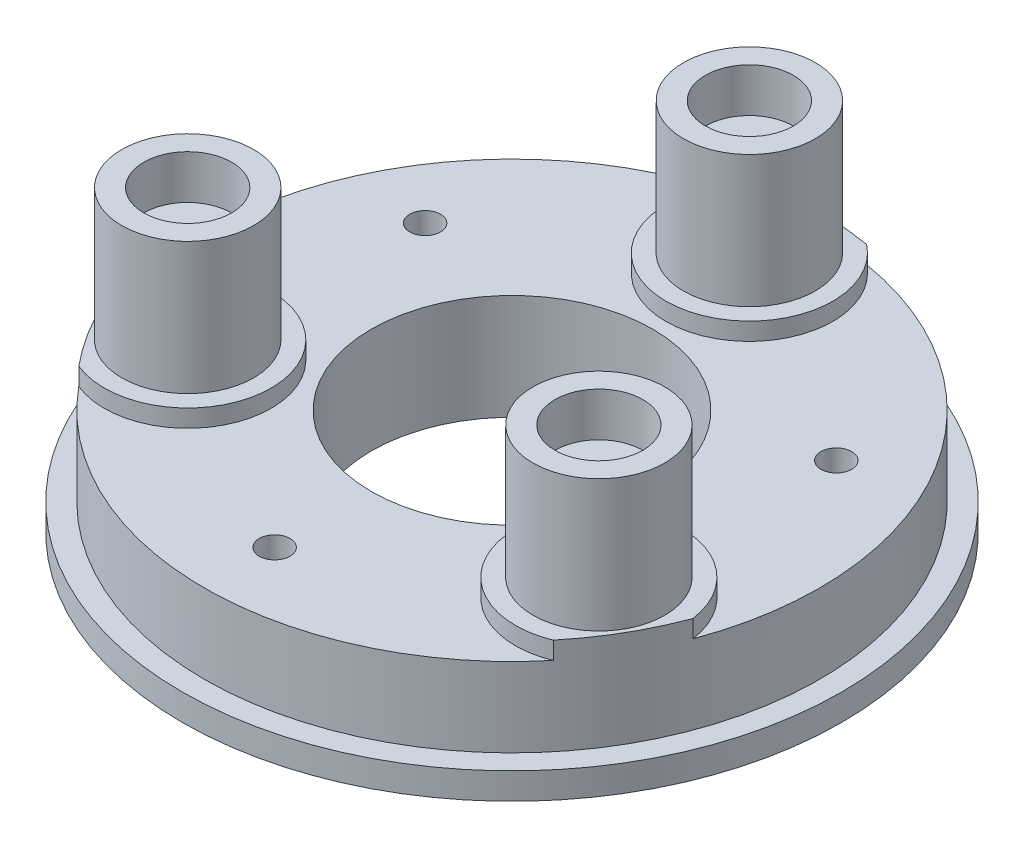
ISO-10303-21;
HEADER;
FILE_DESCRIPTION(('STEP AP214'),'2;1');
FILE_NAME('part.step','',(''),(''),'','','');
FILE_SCHEMA(('AUTOMOTIVE_DESIGN { 1 0 10303 214 1 1 1 1 }'));
ENDSEC;
DATA;
#1=APPLICATION_CONTEXT('core data for automotive mechanical design processes');
#2=APPLICATION_PROTOCOL_DEFINITION('international standard','automotive_design',2000,#1);
#3=PRODUCT_CONTEXT('',#1,'mechanical');
#4=PRODUCT('Part','Part','',(#3));
#5=PRODUCT_RELATED_PRODUCT_CATEGORY('part','',(#4));
#6=PRODUCT_DEFINITION_FORMATION('','',#4);
#7=PRODUCT_DEFINITION_CONTEXT('part definition',#1,'design');
#8=PRODUCT_DEFINITION('design','',#6,#7);
#9=PRODUCT_DEFINITION_SHAPE('','',#8);
#10=(LENGTH_UNIT() NAMED_UNIT(*) SI_UNIT(.MILLI.,.METRE.));
#11=(NAMED_UNIT(*) PLANE_ANGLE_UNIT() SI_UNIT($,.RADIAN.));
#12=(NAMED_UNIT(*) SI_UNIT($,.STERADIAN.) SOLID_ANGLE_UNIT());
#13=UNCERTAINTY_MEASURE_WITH_UNIT(LENGTH_MEASURE(1.E-05),#10,'distance_accuracy_value','');
#14=(GEOMETRIC_REPRESENTATION_CONTEXT(3) GLOBAL_UNCERTAINTY_ASSIGNED_CONTEXT((#13)) GLOBAL_UNIT_ASSIGNED_CONTEXT((#10,
#11,#12)) REPRESENTATION_CONTEXT('',''));
#15=CARTESIAN_POINT('',(0.,0.,0.));
#16=DIRECTION('',(0.,0.,1.));
#17=DIRECTION('',(1.,0.,0.));
#18=AXIS2_PLACEMENT_3D('',#15,#16,#17);
#19=CARTESIAN_POINT('',(0.,3.,0.));
#20=DIRECTION('',(0.,-1.,0.));
#21=DIRECTION('',(0.,0.,-1.));
#22=AXIS2_PLACEMENT_3D('',#19,#20,#21);
#23=CYLINDRICAL_SURFACE('',#22,37.5);
#24=CARTESIAN_POINT('',(0.,3.,0.));
#25=DIRECTION('',(0.,1.,0.));
#26=DIRECTION('',(0.,0.,1.));
#27=AXIS2_PLACEMENT_3D('',#24,#25,#26);
#28=CIRCLE('',#27,37.5);
#29=CARTESIAN_POINT('',(0.,3.,37.5));
#30=VERTEX_POINT('',#29);
#31=EDGE_CURVE('E11',#30,#30,#28,.T.);
#32=ORIENTED_EDGE('',*,*,#31,.F.);
#33=EDGE_LOOP('',(#32));
#34=FACE_BOUND('',#33,.T.);
#35=CARTESIAN_POINT('',(0.,0.,0.));
#36=DIRECTION('',(0.,1.,0.));
#37=DIRECTION('',(0.,0.,1.));
#38=AXIS2_PLACEMENT_3D('',#35,#36,#37);
#39=CIRCLE('',#38,37.5);
#40=CARTESIAN_POINT('',(0.,0.,37.5));
#41=VERTEX_POINT('',#40);
#42=EDGE_CURVE('E50',#41,#41,#39,.T.);
#43=ORIENTED_EDGE('',*,*,#42,.T.);
#44=EDGE_LOOP('',(#43));
#45=FACE_BOUND('',#44,.T.);
#46=ADVANCED_FACE('F41',(#34,#45),#23,.T.);
#47=CARTESIAN_POINT('',(0.,3.,0.));
#48=DIRECTION('',(0.,1.,0.));
#49=DIRECTION('',(0.,0.,1.));
#50=AXIS2_PLACEMENT_3D('',#47,#48,#49);
#51=PLANE('',#50);
#52=CARTESIAN_POINT('',(0.,3.,0.));
#53=DIRECTION('',(0.,1.,0.));
#54=DIRECTION('',(0.,0.,1.));
#55=AXIS2_PLACEMENT_3D('',#52,#53,#54);
#56=CIRCLE('',#55,35.);
#57=CARTESIAN_POINT('',(0.,3.,35.));
#58=VERTEX_POINT('',#57);
#59=EDGE_CURVE('E168',#58,#58,#56,.F.);
#60=ORIENTED_EDGE('',*,*,#59,.T.);
#61=EDGE_LOOP('',(#60));
#62=FACE_BOUND('',#61,.T.);
#63=ORIENTED_EDGE('',*,*,#31,.T.);
#64=EDGE_LOOP('',(#63));
#65=FACE_BOUND('',#64,.T.);
#66=ADVANCED_FACE('F285',(#62,#65),#51,.T.);
#67=CARTESIAN_POINT('',(0.,0.,0.));
#68=DIRECTION('',(0.,1.,0.));
#69=DIRECTION('',(0.,0.,1.));
#70=AXIS2_PLACEMENT_3D('',#67,#68,#69);
#71=PLANE('',#70);
#72=CARTESIAN_POINT('',(23.3826859021799,0.,-13.4999999999999));
#73=DIRECTION('',(0.,1.,0.));
#74=DIRECTION('',(0.,0.,1.));
#75=AXIS2_PLACEMENT_3D('',#72,#73,#74);
#76=CIRCLE('',#75,1.75);
#77=CARTESIAN_POINT('',(23.3826859021799,0.,-11.7499999999999));
#78=VERTEX_POINT('',#77);
#79=EDGE_CURVE('E649',#78,#78,#76,.T.);
#80=ORIENTED_EDGE('',*,*,#79,.T.);
#81=EDGE_LOOP('',(#80));
#82=FACE_BOUND('',#81,.T.);
#83=CARTESIAN_POINT('',(1.62490074036202E-12,0.,27.000000000001));
#84=DIRECTION('',(0.,1.,0.));
#85=DIRECTION('',(0.,0.,1.));
#86=AXIS2_PLACEMENT_3D('',#83,#84,#85);
#87=CIRCLE('',#86,1.75);
#88=CARTESIAN_POINT('',(1.62490074036202E-12,0.,28.750000000001));
#89=VERTEX_POINT('',#88);
#90=EDGE_CURVE('E654',#89,#89,#87,.T.);
#91=ORIENTED_EDGE('',*,*,#90,.T.);
#92=EDGE_LOOP('',(#91));
#93=FACE_BOUND('',#92,.T.);
#94=CARTESIAN_POINT('',(-23.3826859021798,0.,-13.4999999999981));
#95=DIRECTION('',(0.,1.,0.));
#96=DIRECTION('',(0.,0.,1.));
#97=AXIS2_PLACEMENT_3D('',#94,#95,#96);
#98=CIRCLE('',#97,1.75);
#99=CARTESIAN_POINT('',(-23.3826859021798,0.,-11.7499999999981));
#100=VERTEX_POINT('',#99);
#101=EDGE_CURVE('E667',#100,#100,#98,.T.);
#102=ORIENTED_EDGE('',*,*,#101,.T.);
#103=EDGE_LOOP('',(#102));
#104=FACE_BOUND('',#103,.T.);
#105=CARTESIAN_POINT('',(0.,0.,-27.));
#106=DIRECTION('',(0.,-1.,0.));
#107=DIRECTION('',(0.,0.,-1.));
#108=AXIS2_PLACEMENT_3D('',#105,#106,#107);
#109=CIRCLE('',#108,3.525);
#110=CARTESIAN_POINT('',(0.,0.,-30.525));
#111=VERTEX_POINT('',#110);
#112=EDGE_CURVE('E658',#111,#111,#109,.T.);
#113=ORIENTED_EDGE('',*,*,#112,.F.);
#114=EDGE_LOOP('',(#113));
#115=FACE_BOUND('',#114,.T.);
#116=CARTESIAN_POINT('',(-23.3826859021816,0.,13.499999999999));
#117=DIRECTION('',(0.,-1.,0.));
#118=DIRECTION('',(0.,0.,-1.));
#119=AXIS2_PLACEMENT_3D('',#116,#117,#118);
#120=CIRCLE('',#119,3.525);
#121=CARTESIAN_POINT('',(-23.3826859021816,0.,9.974999999999));
#122=VERTEX_POINT('',#121);
#123=EDGE_CURVE('E690',#122,#122,#120,.T.);
#124=ORIENTED_EDGE('',*,*,#123,.F.);
#125=EDGE_LOOP('',(#124));
#126=FACE_BOUND('',#125,.T.);
#127=CARTESIAN_POINT('',(23.3826859021781,0.,13.500000000001));
#128=DIRECTION('',(0.,-1.,0.));
#129=DIRECTION('',(0.,0.,-1.));
#130=AXIS2_PLACEMENT_3D('',#127,#128,#129);
#131=CIRCLE('',#130,3.525);
#132=CARTESIAN_POINT('',(23.3826859021781,0.,9.97500000000099));
#133=VERTEX_POINT('',#132);
#134=EDGE_CURVE('E183',#133,#133,#131,.T.);
#135=ORIENTED_EDGE('',*,*,#134,.F.);
#136=EDGE_LOOP('',(#135));
#137=FACE_BOUND('',#136,.T.);
#138=CARTESIAN_POINT('',(0.,0.,0.));
#139=DIRECTION('',(0.,1.,0.));
#140=DIRECTION('',(0.,0.,1.));
#141=AXIS2_PLACEMENT_3D('',#138,#139,#140);
#142=CIRCLE('',#141,16.);
#143=CARTESIAN_POINT('',(0.,0.,16.));
#144=VERTEX_POINT('',#143);
#145=EDGE_CURVE('E156',#144,#144,#142,.T.);
#146=ORIENTED_EDGE('',*,*,#145,.T.);
#147=EDGE_LOOP('',(#146));
#148=FACE_BOUND('',#147,.T.);
#149=ORIENTED_EDGE('',*,*,#42,.F.);
#150=EDGE_LOOP('',(#149));
#151=FACE_BOUND('',#150,.T.);
#152=ADVANCED_FACE('F290',(#82,#93,#104,#115,#126,#137,#148,#151),#71,.F.);
#153=CARTESIAN_POINT('',(0.,12.,0.));
#154=DIRECTION('',(0.,-1.,0.));
#155=DIRECTION('',(0.,0.,-1.));
#156=AXIS2_PLACEMENT_3D('',#153,#154,#155);
#157=CYLINDRICAL_SURFACE('',#156,35.);
#158=ORIENTED_EDGE('',*,*,#59,.F.);
#159=EDGE_LOOP('',(#158));
#160=FACE_BOUND('',#159,.T.);
#161=CARTESIAN_POINT('',(0.,12.,0.));
#162=DIRECTION('',(0.,1.,0.));
#163=DIRECTION('',(0.,0.,1.));
#164=AXIS2_PLACEMENT_3D('',#161,#162,#163);
#165=CIRCLE('',#164,35.);
#166=CARTESIAN_POINT('',(-26.9833828527782,12.,22.291187716683));
#167=VERTEX_POINT('',#166);
#168=CARTESIAN_POINT('',(26.983382852779,12.,22.291187716682));
#169=VERTEX_POINT('',#168);
#170=EDGE_CURVE('E164',#167,#169,#165,.T.);
#171=ORIENTED_EDGE('',*,*,#170,.F.);
#172=DIRECTION('',(0.,-1.,0.));
#173=VECTOR('',#172,1.);
#174=CARTESIAN_POINT('',(-26.9833828527782,14.,22.291187716683));
#175=LINE('',#174,#173);
#176=CARTESIAN_POINT('',(-26.9833828527782,14.,22.291187716683));
#177=VERTEX_POINT('',#176);
#178=EDGE_CURVE('E151',#177,#167,#175,.T.);
#179=ORIENTED_EDGE('',*,*,#178,.F.);
#180=CARTESIAN_POINT('',(0.,14.,0.));
#181=DIRECTION('',(0.,1.,0.));
#182=DIRECTION('',(0.,0.,1.));
#183=AXIS2_PLACEMENT_3D('',#180,#181,#182);
#184=CIRCLE('',#183,35.);
#185=CARTESIAN_POINT('',(-32.7964262695624,14.,12.2227011722105));
#186=VERTEX_POINT('',#185);
#187=EDGE_CURVE('E137',#186,#177,#184,.T.);
#188=ORIENTED_EDGE('',*,*,#187,.F.);
#189=DIRECTION('',(0.,-1.,0.));
#190=VECTOR('',#189,1.);
#191=CARTESIAN_POINT('',(-32.7964262695624,14.,12.2227011722105));
#192=LINE('',#191,#190);
#193=CARTESIAN_POINT('',(-32.7964262695624,12.,12.2227011722105));
#194=VERTEX_POINT('',#193);
#195=EDGE_CURVE('E144',#186,#194,#192,.T.);
#196=ORIENTED_EDGE('',*,*,#195,.T.);
#197=CARTESIAN_POINT('',(-5.81304341678534,12.,-34.5138888888889));
#198=VERTEX_POINT('',#197);
#199=EDGE_CURVE('E160',#198,#194,#165,.T.);
#200=ORIENTED_EDGE('',*,*,#199,.F.);
#201=DIRECTION('',(0.,-1.,0.));
#202=VECTOR('',#201,1.);
#203=CARTESIAN_POINT('',(-5.81304341678534,14.,-34.5138888888889));
#204=LINE('',#203,#202);
#205=CARTESIAN_POINT('',(-5.81304341678534,14.,-34.5138888888889));
#206=VERTEX_POINT('',#205);
#207=EDGE_CURVE('E66',#206,#198,#204,.T.);
#208=ORIENTED_EDGE('',*,*,#207,.F.);
#209=CARTESIAN_POINT('',(0.,14.,0.));
#210=DIRECTION('',(0.,1.,0.));
#211=DIRECTION('',(0.,0.,1.));
#212=AXIS2_PLACEMENT_3D('',#209,#210,#211);
#213=CIRCLE('',#212,35.);
#214=CARTESIAN_POINT('',(5.81304341678534,14.,-34.5138888888889));
#215=VERTEX_POINT('',#214);
#216=EDGE_CURVE('E120',#215,#206,#213,.T.);
#217=ORIENTED_EDGE('',*,*,#216,.F.);
#218=DIRECTION('',(0.,-1.,0.));
#219=VECTOR('',#218,1.);
#220=CARTESIAN_POINT('',(5.81304341678534,14.,-34.5138888888889));
#221=LINE('',#220,#219);
#222=CARTESIAN_POINT('',(5.81304341678534,12.,-34.5138888888889));
#223=VERTEX_POINT('',#222);
#224=EDGE_CURVE('E130',#215,#223,#221,.T.);
#225=ORIENTED_EDGE('',*,*,#224,.T.);
#226=CARTESIAN_POINT('',(32.7964262695655,12.,12.2227011722024));
#227=VERTEX_POINT('',#226);
#228=EDGE_CURVE('E114',#227,#223,#165,.T.);
#229=ORIENTED_EDGE('',*,*,#228,.F.);
#230=DIRECTION('',(0.,-1.,0.));
#231=VECTOR('',#230,1.);
#232=CARTESIAN_POINT('',(32.7964262695655,14.,12.2227011722024));
#233=LINE('',#232,#231);
#234=CARTESIAN_POINT('',(32.7964262695655,14.,12.2227011722024));
#235=VERTEX_POINT('',#234);
#236=EDGE_CURVE('E58',#235,#227,#233,.T.);
#237=ORIENTED_EDGE('',*,*,#236,.F.);
#238=CARTESIAN_POINT('',(0.,14.,0.));
#239=DIRECTION('',(0.,1.,0.));
#240=DIRECTION('',(0.,0.,1.));
#241=AXIS2_PLACEMENT_3D('',#238,#239,#240);
#242=CIRCLE('',#241,35.);
#243=CARTESIAN_POINT('',(26.983382852779,14.,22.291187716682));
#244=VERTEX_POINT('',#243);
#245=EDGE_CURVE('E103',#244,#235,#242,.T.);
#246=ORIENTED_EDGE('',*,*,#245,.F.);
#247=DIRECTION('',(0.,-1.,0.));
#248=VECTOR('',#247,1.);
#249=CARTESIAN_POINT('',(26.983382852779,14.,22.291187716682));
#250=LINE('',#249,#248);
#251=EDGE_CURVE('E99',#244,#169,#250,.T.);
#252=ORIENTED_EDGE('',*,*,#251,.T.);
#253=EDGE_LOOP('',(#171,#179,#188,#196,#200,#208,#217,#225,#229,#237,#246,#252));
#254=FACE_BOUND('',#253,.T.);
#255=ADVANCED_FACE('F112',(#160,#254),#157,.T.);
#256=CARTESIAN_POINT('',(0.,12.,0.));
#257=DIRECTION('',(0.,1.,0.));
#258=DIRECTION('',(0.,0.,1.));
#259=AXIS2_PLACEMENT_3D('',#256,#257,#258);
#260=PLANE('',#259);
#261=CARTESIAN_POINT('',(23.3826859021799,12.,-13.4999999999999));
#262=DIRECTION('',(0.,1.,0.));
#263=DIRECTION('',(0.,0.,1.));
#264=AXIS2_PLACEMENT_3D('',#261,#262,#263);
#265=CIRCLE('',#264,1.75);
#266=CARTESIAN_POINT('',(23.3826859021799,12.,-11.7499999999999));
#267=VERTEX_POINT('',#266);
#268=EDGE_CURVE('E652',#267,#267,#265,.T.);
#269=ORIENTED_EDGE('',*,*,#268,.F.);
#270=EDGE_LOOP('',(#269));
#271=FACE_BOUND('',#270,.T.);
#272=CARTESIAN_POINT('',(1.62490074036202E-12,12.,27.000000000001));
#273=DIRECTION('',(0.,1.,0.));
#274=DIRECTION('',(0.,0.,1.));
#275=AXIS2_PLACEMENT_3D('',#272,#273,#274);
#276=CIRCLE('',#275,1.75);
#277=CARTESIAN_POINT('',(1.62490074036202E-12,12.,28.750000000001));
#278=VERTEX_POINT('',#277);
#279=EDGE_CURVE('E661',#278,#278,#276,.T.);
#280=ORIENTED_EDGE('',*,*,#279,.F.);
#281=EDGE_LOOP('',(#280));
#282=FACE_BOUND('',#281,.T.);
#283=CARTESIAN_POINT('',(-23.3826859021798,12.,-13.4999999999981));
#284=DIRECTION('',(0.,1.,0.));
#285=DIRECTION('',(0.,0.,1.));
#286=AXIS2_PLACEMENT_3D('',#283,#284,#285);
#287=CIRCLE('',#286,1.75);
#288=CARTESIAN_POINT('',(-23.3826859021798,12.,-11.7499999999981));
#289=VERTEX_POINT('',#288);
#290=EDGE_CURVE('E671',#289,#289,#287,.T.);
#291=ORIENTED_EDGE('',*,*,#290,.F.);
#292=EDGE_LOOP('',(#291));
#293=FACE_BOUND('',#292,.T.);
#294=ORIENTED_EDGE('',*,*,#170,.T.);
#295=CARTESIAN_POINT('',(23.3826859021818,12.,13.4999999999989));
#296=DIRECTION('',(0.,1.,0.));
#297=DIRECTION('',(0.,0.,1.));
#298=AXIS2_PLACEMENT_3D('',#295,#296,#297);
#299=CIRCLE('',#298,9.5);
#300=EDGE_CURVE('E108',#227,#169,#299,.T.);
#301=ORIENTED_EDGE('',*,*,#300,.F.);
#302=ORIENTED_EDGE('',*,*,#228,.T.);
#303=CARTESIAN_POINT('',(0.,12.,-27.));
#304=DIRECTION('',(0.,1.,0.));
#305=DIRECTION('',(0.,0.,1.));
#306=AXIS2_PLACEMENT_3D('',#303,#304,#305);
#307=CIRCLE('',#306,9.5);
#308=EDGE_CURVE('E116',#198,#223,#307,.T.);
#309=ORIENTED_EDGE('',*,*,#308,.F.);
#310=ORIENTED_EDGE('',*,*,#199,.T.);
#311=CARTESIAN_POINT('',(-23.3826859021779,12.,13.5000000000011));
#312=DIRECTION('',(0.,1.,0.));
#313=DIRECTION('',(0.,0.,1.));
#314=AXIS2_PLACEMENT_3D('',#311,#312,#313);
#315=CIRCLE('',#314,9.50000000000001);
#316=EDGE_CURVE('E136',#167,#194,#315,.T.);
#317=ORIENTED_EDGE('',*,*,#316,.F.);
#318=EDGE_LOOP('',(#294,#301,#302,#309,#310,#317));
#319=FACE_BOUND('',#318,.T.);
#320=CARTESIAN_POINT('',(0.,12.,0.));
#321=DIRECTION('',(0.,1.,0.));
#322=DIRECTION('',(0.,0.,1.));
#323=AXIS2_PLACEMENT_3D('',#320,#321,#322);
#324=CIRCLE('',#323,16.);
#325=CARTESIAN_POINT('',(0.,12.,16.));
#326=VERTEX_POINT('',#325);
#327=EDGE_CURVE('E155',#326,#326,#324,.T.);
#328=ORIENTED_EDGE('',*,*,#327,.F.);
#329=EDGE_LOOP('',(#328));
#330=FACE_BOUND('',#329,.T.);
#331=ADVANCED_FACE('F262',(#271,#282,#293,#319,#330),#260,.T.);
#332=CARTESIAN_POINT('',(0.,0.,0.));
#333=DIRECTION('',(0.,1.,0.));
#334=DIRECTION('',(0.,0.,1.));
#335=AXIS2_PLACEMENT_3D('',#332,#333,#334);
#336=CYLINDRICAL_SURFACE('',#335,16.);
#337=ORIENTED_EDGE('',*,*,#145,.F.);
#338=EDGE_LOOP('',(#337));
#339=FACE_BOUND('',#338,.T.);
#340=ORIENTED_EDGE('',*,*,#327,.T.);
#341=EDGE_LOOP('',(#340));
#342=FACE_BOUND('',#341,.T.);
#343=ADVANCED_FACE('F281',(#339,#342),#336,.F.);
#344=CARTESIAN_POINT('',(-23.3826859021779,14.,13.5000000000011));
#345=DIRECTION('',(0.,-1.,0.));
#346=DIRECTION('',(0.,0.,-1.));
#347=AXIS2_PLACEMENT_3D('',#344,#345,#346);
#348=CYLINDRICAL_SURFACE('',#347,9.50000000000001);
#349=ORIENTED_EDGE('',*,*,#316,.T.);
#350=ORIENTED_EDGE('',*,*,#195,.F.);
#351=CARTESIAN_POINT('',(-23.3826859021779,14.,13.5000000000011));
#352=DIRECTION('',(0.,1.,0.));
#353=DIRECTION('',(0.,0.,1.));
#354=AXIS2_PLACEMENT_3D('',#351,#352,#353);
#355=CIRCLE('',#354,9.50000000000001);
#356=EDGE_CURVE('E141',#177,#186,#355,.T.);
#357=ORIENTED_EDGE('',*,*,#356,.F.);
#358=ORIENTED_EDGE('',*,*,#178,.T.);
#359=EDGE_LOOP('',(#349,#350,#357,#358));
#360=FACE_BOUND('',#359,.T.);
#361=ADVANCED_FACE('F267',(#360),#348,.T.);
#362=CARTESIAN_POINT('',(0.,14.,0.));
#363=DIRECTION('',(0.,1.,0.));
#364=DIRECTION('',(0.,0.,1.));
#365=AXIS2_PLACEMENT_3D('',#362,#363,#364);
#366=PLANE('',#365);
#367=CARTESIAN_POINT('',(-23.3826859021781,14.,13.500000000001));
#368=DIRECTION('',(0.,1.,0.));
#369=DIRECTION('',(0.,0.,1.));
#370=AXIS2_PLACEMENT_3D('',#367,#368,#369);
#371=CIRCLE('',#370,7.50000000000218);
#372=CARTESIAN_POINT('',(-23.3826859021781,14.,21.0000000000032));
#373=VERTEX_POINT('',#372);
#374=EDGE_CURVE('E217',#373,#373,#371,.T.);
#375=ORIENTED_EDGE('',*,*,#374,.F.);
#376=EDGE_LOOP('',(#375));
#377=FACE_BOUND('',#376,.T.);
#378=ORIENTED_EDGE('',*,*,#187,.T.);
#379=ORIENTED_EDGE('',*,*,#356,.T.);
#380=EDGE_LOOP('',(#378,#379));
#381=FACE_BOUND('',#380,.T.);
#382=ADVANCED_FACE('F270',(#377,#381),#366,.T.);
#383=CARTESIAN_POINT('',(0.,14.,-27.));
#384=DIRECTION('',(0.,-1.,0.));
#385=DIRECTION('',(0.,0.,-1.));
#386=AXIS2_PLACEMENT_3D('',#383,#384,#385);
#387=CYLINDRICAL_SURFACE('',#386,9.5);
#388=ORIENTED_EDGE('',*,*,#308,.T.);
#389=ORIENTED_EDGE('',*,*,#224,.F.);
#390=CARTESIAN_POINT('',(0.,14.,-27.));
#391=DIRECTION('',(0.,1.,0.));
#392=DIRECTION('',(0.,0.,1.));
#393=AXIS2_PLACEMENT_3D('',#390,#391,#392);
#394=CIRCLE('',#393,9.5);
#395=EDGE_CURVE('E128',#206,#215,#394,.T.);
#396=ORIENTED_EDGE('',*,*,#395,.F.);
#397=ORIENTED_EDGE('',*,*,#207,.T.);
#398=EDGE_LOOP('',(#388,#389,#396,#397));
#399=FACE_BOUND('',#398,.T.);
#400=ADVANCED_FACE('F272',(#399),#387,.T.);
#401=CARTESIAN_POINT('',(0.,14.,0.));
#402=DIRECTION('',(0.,1.,0.));
#403=DIRECTION('',(0.,0.,1.));
#404=AXIS2_PLACEMENT_3D('',#401,#402,#403);
#405=PLANE('',#404);
#406=CARTESIAN_POINT('',(0.,14.,-27.));
#407=DIRECTION('',(0.,1.,0.));
#408=DIRECTION('',(0.,0.,1.));
#409=AXIS2_PLACEMENT_3D('',#406,#407,#408);
#410=CIRCLE('',#409,7.5);
#411=CARTESIAN_POINT('',(0.,14.,-19.5));
#412=VERTEX_POINT('',#411);
#413=EDGE_CURVE('E249',#412,#412,#410,.T.);
#414=ORIENTED_EDGE('',*,*,#413,.F.);
#415=EDGE_LOOP('',(#414));
#416=FACE_BOUND('',#415,.T.);
#417=ORIENTED_EDGE('',*,*,#216,.T.);
#418=ORIENTED_EDGE('',*,*,#395,.T.);
#419=EDGE_LOOP('',(#417,#418));
#420=FACE_BOUND('',#419,.T.);
#421=ADVANCED_FACE('F279',(#416,#420),#405,.T.);
#422=CARTESIAN_POINT('',(23.3826859021818,14.,13.4999999999989));
#423=DIRECTION('',(0.,-1.,0.));
#424=DIRECTION('',(0.,0.,-1.));
#425=AXIS2_PLACEMENT_3D('',#422,#423,#424);
#426=CYLINDRICAL_SURFACE('',#425,9.5);
#427=ORIENTED_EDGE('',*,*,#300,.T.);
#428=ORIENTED_EDGE('',*,*,#251,.F.);
#429=CARTESIAN_POINT('',(23.3826859021818,14.,13.4999999999989));
#430=DIRECTION('',(0.,1.,0.));
#431=DIRECTION('',(0.,0.,1.));
#432=AXIS2_PLACEMENT_3D('',#429,#430,#431);
#433=CIRCLE('',#432,9.5);
#434=EDGE_CURVE('E95',#235,#244,#433,.T.);
#435=ORIENTED_EDGE('',*,*,#434,.F.);
#436=ORIENTED_EDGE('',*,*,#236,.T.);
#437=EDGE_LOOP('',(#427,#428,#435,#436));
#438=FACE_BOUND('',#437,.T.);
#439=ADVANCED_FACE('F97',(#438),#426,.T.);
#440=CARTESIAN_POINT('',(0.,14.,0.));
#441=DIRECTION('',(0.,1.,0.));
#442=DIRECTION('',(0.,0.,1.));
#443=AXIS2_PLACEMENT_3D('',#440,#441,#442);
#444=PLANE('',#443);
#445=CARTESIAN_POINT('',(23.3826859021816,14.,13.499999999999));
#446=DIRECTION('',(0.,1.,0.));
#447=DIRECTION('',(0.,0.,1.));
#448=AXIS2_PLACEMENT_3D('',#445,#446,#447);
#449=CIRCLE('',#448,7.50000000000147);
#450=CARTESIAN_POINT('',(23.3826859021816,14.,21.0000000000005));
#451=VERTEX_POINT('',#450);
#452=EDGE_CURVE('E241',#451,#451,#449,.T.);
#453=ORIENTED_EDGE('',*,*,#452,.F.);
#454=EDGE_LOOP('',(#453));
#455=FACE_BOUND('',#454,.T.);
#456=ORIENTED_EDGE('',*,*,#245,.T.);
#457=ORIENTED_EDGE('',*,*,#434,.T.);
#458=EDGE_LOOP('',(#456,#457));
#459=FACE_BOUND('',#458,.T.);
#460=ADVANCED_FACE('F105',(#455,#459),#444,.T.);
#461=CARTESIAN_POINT('',(0.,29.,-27.));
#462=DIRECTION('',(0.,-1.,0.));
#463=DIRECTION('',(0.,0.,-1.));
#464=AXIS2_PLACEMENT_3D('',#461,#462,#463);
#465=CYLINDRICAL_SURFACE('',#464,7.5);
#466=CARTESIAN_POINT('',(0.,29.,-27.));
#467=DIRECTION('',(0.,1.,0.));
#468=DIRECTION('',(0.,0.,1.));
#469=AXIS2_PLACEMENT_3D('',#466,#467,#468);
#470=CIRCLE('',#469,7.5);
#471=CARTESIAN_POINT('',(0.,29.,-19.5));
#472=VERTEX_POINT('',#471);
#473=EDGE_CURVE('E253',#472,#472,#470,.T.);
#474=ORIENTED_EDGE('',*,*,#473,.F.);
#475=EDGE_LOOP('',(#474));
#476=FACE_BOUND('',#475,.T.);
#477=ORIENTED_EDGE('',*,*,#413,.T.);
#478=EDGE_LOOP('',(#477));
#479=FACE_BOUND('',#478,.T.);
#480=ADVANCED_FACE('F364',(#476,#479),#465,.T.);
#481=CARTESIAN_POINT('',(0.,29.,-27.));
#482=DIRECTION('',(0.,1.,0.));
#483=DIRECTION('',(0.,0.,1.));
#484=AXIS2_PLACEMENT_3D('',#481,#482,#483);
#485=PLANE('',#484);
#486=CARTESIAN_POINT('',(0.,29.,-27.));
#487=DIRECTION('',(0.,1.,0.));
#488=DIRECTION('',(0.,0.,1.));
#489=AXIS2_PLACEMENT_3D('',#486,#487,#488);
#490=CIRCLE('',#489,5.);
#491=CARTESIAN_POINT('',(0.,29.,-22.));
#492=VERTEX_POINT('',#491);
#493=EDGE_CURVE('E218',#492,#492,#490,.T.);
#494=ORIENTED_EDGE('',*,*,#493,.F.);
#495=EDGE_LOOP('',(#494));
#496=FACE_BOUND('',#495,.T.);
#497=ORIENTED_EDGE('',*,*,#473,.T.);
#498=EDGE_LOOP('',(#497));
#499=FACE_BOUND('',#498,.T.);
#500=ADVANCED_FACE('F374',(#496,#499),#485,.T.);
#501=CARTESIAN_POINT('',(23.3826859021816,29.,13.499999999999));
#502=DIRECTION('',(0.,-1.,0.));
#503=DIRECTION('',(0.,0.,-1.));
#504=AXIS2_PLACEMENT_3D('',#501,#502,#503);
#505=CYLINDRICAL_SURFACE('',#504,7.50000000000147);
#506=CARTESIAN_POINT('',(23.3826859021816,29.,13.499999999999));
#507=DIRECTION('',(0.,1.,0.));
#508=DIRECTION('',(0.,0.,1.));
#509=AXIS2_PLACEMENT_3D('',#506,#507,#508);
#510=CIRCLE('',#509,7.50000000000147);
#511=CARTESIAN_POINT('',(23.3826859021816,29.,21.0000000000005));
#512=VERTEX_POINT('',#511);
#513=EDGE_CURVE('E245',#512,#512,#510,.T.);
#514=ORIENTED_EDGE('',*,*,#513,.F.);
#515=EDGE_LOOP('',(#514));
#516=FACE_BOUND('',#515,.T.);
#517=ORIENTED_EDGE('',*,*,#452,.T.);
#518=EDGE_LOOP('',(#517));
#519=FACE_BOUND('',#518,.T.);
#520=ADVANCED_FACE('F382',(#516,#519),#505,.T.);
#521=CARTESIAN_POINT('',(23.3826859021816,29.,13.499999999999));
#522=DIRECTION('',(0.,1.,0.));
#523=DIRECTION('',(0.,0.,1.));
#524=AXIS2_PLACEMENT_3D('',#521,#522,#523);
#525=PLANE('',#524);
#526=CARTESIAN_POINT('',(23.382685902181,29.,13.4999999999993));
#527=DIRECTION('',(0.,1.,0.));
#528=DIRECTION('',(0.,0.,1.));
#529=AXIS2_PLACEMENT_3D('',#526,#527,#528);
#530=CIRCLE('',#529,5.00000000000102);
#531=CARTESIAN_POINT('',(23.382685902181,29.,18.5000000000004));
#532=VERTEX_POINT('',#531);
#533=EDGE_CURVE('E226',#532,#532,#530,.T.);
#534=ORIENTED_EDGE('',*,*,#533,.F.);
#535=EDGE_LOOP('',(#534));
#536=FACE_BOUND('',#535,.T.);
#537=ORIENTED_EDGE('',*,*,#513,.T.);
#538=EDGE_LOOP('',(#537));
#539=FACE_BOUND('',#538,.T.);
#540=ADVANCED_FACE('F387',(#536,#539),#525,.T.);
#541=CARTESIAN_POINT('',(-23.3826859021781,29.,13.500000000001));
#542=DIRECTION('',(0.,-1.,0.));
#543=DIRECTION('',(0.,0.,-1.));
#544=AXIS2_PLACEMENT_3D('',#541,#542,#543);
#545=CYLINDRICAL_SURFACE('',#544,7.50000000000218);
#546=CARTESIAN_POINT('',(-23.3826859021781,29.,13.500000000001));
#547=DIRECTION('',(0.,1.,0.));
#548=DIRECTION('',(0.,0.,1.));
#549=AXIS2_PLACEMENT_3D('',#546,#547,#548);
#550=CIRCLE('',#549,7.50000000000218);
#551=CARTESIAN_POINT('',(-23.3826859021781,29.,21.0000000000032));
#552=VERTEX_POINT('',#551);
#553=EDGE_CURVE('E237',#552,#552,#550,.T.);
#554=ORIENTED_EDGE('',*,*,#553,.F.);
#555=EDGE_LOOP('',(#554));
#556=FACE_BOUND('',#555,.T.);
#557=ORIENTED_EDGE('',*,*,#374,.T.);
#558=EDGE_LOOP('',(#557));
#559=FACE_BOUND('',#558,.T.);
#560=ADVANCED_FACE('F395',(#556,#559),#545,.T.);
#561=CARTESIAN_POINT('',(-23.3826859021781,29.,13.500000000001));
#562=DIRECTION('',(0.,1.,0.));
#563=DIRECTION('',(0.,0.,1.));
#564=AXIS2_PLACEMENT_3D('',#561,#562,#563);
#565=PLANE('',#564);
#566=CARTESIAN_POINT('',(-23.3826859021787,29.,13.5000000000007));
#567=DIRECTION('',(0.,1.,0.));
#568=DIRECTION('',(0.,0.,1.));
#569=AXIS2_PLACEMENT_3D('',#566,#567,#568);
#570=CIRCLE('',#569,5.00000000000154);
#571=CARTESIAN_POINT('',(-23.3826859021787,29.,18.5000000000022));
#572=VERTEX_POINT('',#571);
#573=EDGE_CURVE('E178',#572,#572,#570,.T.);
#574=ORIENTED_EDGE('',*,*,#573,.F.);
#575=EDGE_LOOP('',(#574));
#576=FACE_BOUND('',#575,.T.);
#577=ORIENTED_EDGE('',*,*,#553,.T.);
#578=EDGE_LOOP('',(#577));
#579=FACE_BOUND('',#578,.T.);
#580=ADVANCED_FACE('F400',(#576,#579),#565,.T.);
#581=CARTESIAN_POINT('',(-23.3826859021787,24.,13.5000000000007));
#582=DIRECTION('',(0.,1.,0.));
#583=DIRECTION('',(0.,0.,1.));
#584=AXIS2_PLACEMENT_3D('',#581,#582,#583);
#585=CYLINDRICAL_SURFACE('',#584,5.00000000000154);
#586=CARTESIAN_POINT('',(-23.3826859021787,24.,13.5000000000007));
#587=DIRECTION('',(0.,1.,0.));
#588=DIRECTION('',(0.,0.,1.));
#589=AXIS2_PLACEMENT_3D('',#586,#587,#588);
#590=CIRCLE('',#589,5.00000000000154);
#591=CARTESIAN_POINT('',(-23.3826859021787,24.,18.5000000000022));
#592=VERTEX_POINT('',#591);
#593=EDGE_CURVE('E230',#592,#592,#590,.T.);
#594=ORIENTED_EDGE('',*,*,#593,.F.);
#595=EDGE_LOOP('',(#594));
#596=FACE_BOUND('',#595,.T.);
#597=ORIENTED_EDGE('',*,*,#573,.T.);
#598=EDGE_LOOP('',(#597));
#599=FACE_BOUND('',#598,.T.);
#600=ADVANCED_FACE('F424',(#596,#599),#585,.F.);
#601=CARTESIAN_POINT('',(-23.3826859021787,24.,13.5000000000007));
#602=DIRECTION('',(0.,1.,0.));
#603=DIRECTION('',(0.,0.,1.));
#604=AXIS2_PLACEMENT_3D('',#601,#602,#603);
#605=PLANE('',#604);
#606=CARTESIAN_POINT('',(-23.3826859021816,24.,13.499999999999));
#607=DIRECTION('',(0.,1.,0.));
#608=DIRECTION('',(0.,0.,1.));
#609=AXIS2_PLACEMENT_3D('',#606,#607,#608);
#610=CIRCLE('',#609,1.8);
#611=CARTESIAN_POINT('',(-23.3826859021816,24.,15.299999999999));
#612=VERTEX_POINT('',#611);
#613=EDGE_CURVE('E180',#612,#612,#610,.T.);
#614=ORIENTED_EDGE('',*,*,#613,.F.);
#615=EDGE_LOOP('',(#614));
#616=FACE_BOUND('',#615,.T.);
#617=ORIENTED_EDGE('',*,*,#593,.T.);
#618=EDGE_LOOP('',(#617));
#619=FACE_BOUND('',#618,.T.);
#620=ADVANCED_FACE('F434',(#616,#619),#605,.T.);
#621=CARTESIAN_POINT('',(23.382685902181,24.,13.4999999999993));
#622=DIRECTION('',(0.,1.,0.));
#623=DIRECTION('',(0.,0.,1.));
#624=AXIS2_PLACEMENT_3D('',#621,#622,#623);
#625=CYLINDRICAL_SURFACE('',#624,5.00000000000102);
#626=CARTESIAN_POINT('',(23.382685902181,24.,13.4999999999993));
#627=DIRECTION('',(0.,1.,0.));
#628=DIRECTION('',(0.,0.,1.));
#629=AXIS2_PLACEMENT_3D('',#626,#627,#628);
#630=CIRCLE('',#629,5.00000000000102);
#631=CARTESIAN_POINT('',(23.382685902181,24.,18.5000000000004));
#632=VERTEX_POINT('',#631);
#633=EDGE_CURVE('E222',#632,#632,#630,.T.);
#634=ORIENTED_EDGE('',*,*,#633,.F.);
#635=EDGE_LOOP('',(#634));
#636=FACE_BOUND('',#635,.T.);
#637=ORIENTED_EDGE('',*,*,#533,.T.);
#638=EDGE_LOOP('',(#637));
#639=FACE_BOUND('',#638,.T.);
#640=ADVANCED_FACE('F442',(#636,#639),#625,.F.);
#641=CARTESIAN_POINT('',(23.382685902181,24.,13.4999999999993));
#642=DIRECTION('',(0.,1.,0.));
#643=DIRECTION('',(0.,0.,1.));
#644=AXIS2_PLACEMENT_3D('',#641,#642,#643);
#645=PLANE('',#644);
#646=CARTESIAN_POINT('',(23.3826859021781,24.,13.500000000001));
#647=DIRECTION('',(0.,1.,0.));
#648=DIRECTION('',(0.,0.,1.));
#649=AXIS2_PLACEMENT_3D('',#646,#647,#648);
#650=CIRCLE('',#649,1.8);
#651=CARTESIAN_POINT('',(23.3826859021781,24.,15.300000000001));
#652=VERTEX_POINT('',#651);
#653=EDGE_CURVE('E175',#652,#652,#650,.T.);
#654=ORIENTED_EDGE('',*,*,#653,.F.);
#655=EDGE_LOOP('',(#654));
#656=FACE_BOUND('',#655,.T.);
#657=ORIENTED_EDGE('',*,*,#633,.T.);
#658=EDGE_LOOP('',(#657));
#659=FACE_BOUND('',#658,.T.);
#660=ADVANCED_FACE('F447',(#656,#659),#645,.T.);
#661=CARTESIAN_POINT('',(0.,24.,-27.));
#662=DIRECTION('',(0.,1.,0.));
#663=DIRECTION('',(0.,0.,1.));
#664=AXIS2_PLACEMENT_3D('',#661,#662,#663);
#665=CYLINDRICAL_SURFACE('',#664,5.);
#666=CARTESIAN_POINT('',(0.,24.,-27.));
#667=DIRECTION('',(0.,1.,0.));
#668=DIRECTION('',(0.,0.,1.));
#669=AXIS2_PLACEMENT_3D('',#666,#667,#668);
#670=CIRCLE('',#669,5.);
#671=CARTESIAN_POINT('',(0.,24.,-22.));
#672=VERTEX_POINT('',#671);
#673=EDGE_CURVE('E213',#672,#672,#670,.T.);
#674=ORIENTED_EDGE('',*,*,#673,.F.);
#675=EDGE_LOOP('',(#674));
#676=FACE_BOUND('',#675,.T.);
#677=ORIENTED_EDGE('',*,*,#493,.T.);
#678=EDGE_LOOP('',(#677));
#679=FACE_BOUND('',#678,.T.);
#680=ADVANCED_FACE('F455',(#676,#679),#665,.F.);
#681=CARTESIAN_POINT('',(0.,24.,-27.));
#682=DIRECTION('',(0.,1.,0.));
#683=DIRECTION('',(0.,0.,1.));
#684=AXIS2_PLACEMENT_3D('',#681,#682,#683);
#685=PLANE('',#684);
#686=CARTESIAN_POINT('',(0.,24.,-27.));
#687=DIRECTION('',(0.,1.,0.));
#688=DIRECTION('',(0.,0.,1.));
#689=AXIS2_PLACEMENT_3D('',#686,#687,#688);
#690=CIRCLE('',#689,1.8);
#691=CARTESIAN_POINT('',(0.,24.,-25.2));
#692=VERTEX_POINT('',#691);
#693=EDGE_CURVE('E44',#692,#692,#690,.T.);
#694=ORIENTED_EDGE('',*,*,#693,.F.);
#695=EDGE_LOOP('',(#694));
#696=FACE_BOUND('',#695,.T.);
#697=ORIENTED_EDGE('',*,*,#673,.T.);
#698=EDGE_LOOP('',(#697));
#699=FACE_BOUND('',#698,.T.);
#700=ADVANCED_FACE('F460',(#696,#699),#685,.T.);
#701=CARTESIAN_POINT('',(23.3826859021781,0.,13.500000000001));
#702=DIRECTION('',(0.,-1.,0.));
#703=DIRECTION('',(0.,0.,-1.));
#704=AXIS2_PLACEMENT_3D('',#701,#702,#703);
#705=CYLINDRICAL_SURFACE('',#704,1.8);
#706=ORIENTED_EDGE('',*,*,#653,.T.);
#707=EDGE_LOOP('',(#706));
#708=FACE_BOUND('',#707,.T.);
#709=CARTESIAN_POINT('',(23.3826859021781,2.4,13.500000000001));
#710=DIRECTION('',(0.,-1.,0.));
#711=DIRECTION('',(0.,0.,-1.));
#712=AXIS2_PLACEMENT_3D('',#709,#710,#711);
#713=CIRCLE('',#712,1.8);
#714=CARTESIAN_POINT('',(23.3826859021781,2.4,11.700000000001));
#715=VERTEX_POINT('',#714);
#716=EDGE_CURVE('E179',#715,#715,#713,.T.);
#717=ORIENTED_EDGE('',*,*,#716,.T.);
#718=EDGE_LOOP('',(#717));
#719=FACE_BOUND('',#718,.T.);
#720=ADVANCED_FACE('F484',(#708,#719),#705,.F.);
#721=CARTESIAN_POINT('',(26.8826859021781,2.4,13.500000000001));
#722=DIRECTION('',(0.,1.,0.));
#723=DIRECTION('',(0.,0.,1.));
#724=AXIS2_PLACEMENT_3D('',#721,#722,#723);
#725=PLANE('',#724);
#726=ORIENTED_EDGE('',*,*,#716,.F.);
#727=EDGE_LOOP('',(#726));
#728=FACE_BOUND('',#727,.T.);
#729=CARTESIAN_POINT('',(23.3826859021781,2.4,13.500000000001));
#730=DIRECTION('',(0.,-1.,0.));
#731=DIRECTION('',(0.,0.,-1.));
#732=AXIS2_PLACEMENT_3D('',#729,#730,#731);
#733=CIRCLE('',#732,3.5);
#734=CARTESIAN_POINT('',(23.3826859021781,2.4,10.000000000001));
#735=VERTEX_POINT('',#734);
#736=EDGE_CURVE('E206',#735,#735,#733,.T.);
#737=ORIENTED_EDGE('',*,*,#736,.T.);
#738=EDGE_LOOP('',(#737));
#739=FACE_BOUND('',#738,.T.);
#740=ADVANCED_FACE('F494',(#728,#739),#725,.F.);
#741=CARTESIAN_POINT('',(23.3826859021781,0.,13.500000000001));
#742=DIRECTION('',(0.,-1.,0.));
#743=DIRECTION('',(0.,0.,-1.));
#744=AXIS2_PLACEMENT_3D('',#741,#742,#743);
#745=CYLINDRICAL_SURFACE('',#744,3.5);
#746=ORIENTED_EDGE('',*,*,#736,.F.);
#747=EDGE_LOOP('',(#746));
#748=FACE_BOUND('',#747,.T.);
#749=CARTESIAN_POINT('',(23.3826859021781,0.0250000000000007,13.500000000001));
#750=DIRECTION('',(0.,-1.,0.));
#751=DIRECTION('',(0.,0.,-1.));
#752=AXIS2_PLACEMENT_3D('',#749,#750,#751);
#753=CIRCLE('',#752,3.5);
#754=CARTESIAN_POINT('',(23.3826859021781,0.0250000000000007,10.000000000001));
#755=VERTEX_POINT('',#754);
#756=EDGE_CURVE('E190',#755,#755,#753,.T.);
#757=ORIENTED_EDGE('',*,*,#756,.T.);
#758=EDGE_LOOP('',(#757));
#759=FACE_BOUND('',#758,.T.);
#760=ADVANCED_FACE('F504',(#748,#759),#745,.F.);
#761=CARTESIAN_POINT('',(23.3826859021781,0.,13.500000000001));
#762=DIRECTION('',(0.,-1.,0.));
#763=DIRECTION('',(0.,0.,-1.));
#764=AXIS2_PLACEMENT_3D('',#761,#762,#763);
#765=CONICAL_SURFACE('',#764,3.525,0.785398163397379);
#766=ORIENTED_EDGE('',*,*,#756,.F.);
#767=EDGE_LOOP('',(#766));
#768=FACE_BOUND('',#767,.T.);
#769=ORIENTED_EDGE('',*,*,#134,.T.);
#770=EDGE_LOOP('',(#769));
#771=FACE_BOUND('',#770,.T.);
#772=ADVANCED_FACE('F514',(#768,#771),#765,.F.);
#773=CARTESIAN_POINT('',(-23.3826859021816,0.,13.499999999999));
#774=DIRECTION('',(0.,-1.,0.));
#775=DIRECTION('',(0.,0.,-1.));
#776=AXIS2_PLACEMENT_3D('',#773,#774,#775);
#777=CYLINDRICAL_SURFACE('',#776,1.8);
#778=ORIENTED_EDGE('',*,*,#613,.T.);
#779=EDGE_LOOP('',(#778));
#780=FACE_BOUND('',#779,.T.);
#781=CARTESIAN_POINT('',(-23.3826859021816,2.4,13.499999999999));
#782=DIRECTION('',(0.,-1.,0.));
#783=DIRECTION('',(0.,0.,-1.));
#784=AXIS2_PLACEMENT_3D('',#781,#782,#783);
#785=CIRCLE('',#784,1.8);
#786=CARTESIAN_POINT('',(-23.3826859021816,2.4,11.699999999999));
#787=VERTEX_POINT('',#786);
#788=EDGE_CURVE('E184',#787,#787,#785,.T.);
#789=ORIENTED_EDGE('',*,*,#788,.T.);
#790=EDGE_LOOP('',(#789));
#791=FACE_BOUND('',#790,.T.);
#792=ADVANCED_FACE('F524',(#780,#791),#777,.F.);
#793=CARTESIAN_POINT('',(-19.8826859021816,2.4,13.499999999999));
#794=DIRECTION('',(0.,1.,0.));
#795=DIRECTION('',(0.,0.,1.));
#796=AXIS2_PLACEMENT_3D('',#793,#794,#795);
#797=PLANE('',#796);
#798=ORIENTED_EDGE('',*,*,#788,.F.);
#799=EDGE_LOOP('',(#798));
#800=FACE_BOUND('',#799,.T.);
#801=CARTESIAN_POINT('',(-23.3826859021816,2.4,13.499999999999));
#802=DIRECTION('',(0.,-1.,0.));
#803=DIRECTION('',(0.,0.,-1.));
#804=AXIS2_PLACEMENT_3D('',#801,#802,#803);
#805=CIRCLE('',#804,3.5);
#806=CARTESIAN_POINT('',(-23.3826859021816,2.4,9.99999999999901));
#807=VERTEX_POINT('',#806);
#808=EDGE_CURVE('E193',#807,#807,#805,.T.);
#809=ORIENTED_EDGE('',*,*,#808,.T.);
#810=EDGE_LOOP('',(#809));
#811=FACE_BOUND('',#810,.T.);
#812=ADVANCED_FACE('F534',(#800,#811),#797,.F.);
#813=CARTESIAN_POINT('',(-23.3826859021816,0.,13.499999999999));
#814=DIRECTION('',(0.,-1.,0.));
#815=DIRECTION('',(0.,0.,-1.));
#816=AXIS2_PLACEMENT_3D('',#813,#814,#815);
#817=CYLINDRICAL_SURFACE('',#816,3.5);
#818=ORIENTED_EDGE('',*,*,#808,.F.);
#819=EDGE_LOOP('',(#818));
#820=FACE_BOUND('',#819,.T.);
#821=CARTESIAN_POINT('',(-23.3826859021816,0.0250000000000007,13.499999999999));
#822=DIRECTION('',(0.,-1.,0.));
#823=DIRECTION('',(0.,0.,-1.));
#824=AXIS2_PLACEMENT_3D('',#821,#822,#823);
#825=CIRCLE('',#824,3.5);
#826=CARTESIAN_POINT('',(-23.3826859021816,0.0250000000000007,9.99999999999901));
#827=VERTEX_POINT('',#826);
#828=EDGE_CURVE('E199',#827,#827,#825,.T.);
#829=ORIENTED_EDGE('',*,*,#828,.T.);
#830=EDGE_LOOP('',(#829));
#831=FACE_BOUND('',#830,.T.);
#832=ADVANCED_FACE('F543',(#820,#831),#817,.F.);
#833=CARTESIAN_POINT('',(-23.3826859021816,0.,13.499999999999));
#834=DIRECTION('',(0.,-1.,0.));
#835=DIRECTION('',(0.,0.,-1.));
#836=AXIS2_PLACEMENT_3D('',#833,#834,#835);
#837=CONICAL_SURFACE('',#836,3.525,0.785398163397379);
#838=ORIENTED_EDGE('',*,*,#828,.F.);
#839=EDGE_LOOP('',(#838));
#840=FACE_BOUND('',#839,.T.);
#841=ORIENTED_EDGE('',*,*,#123,.T.);
#842=EDGE_LOOP('',(#841));
#843=FACE_BOUND('',#842,.T.);
#844=ADVANCED_FACE('F553',(#840,#843),#837,.F.);
#845=CARTESIAN_POINT('',(0.,0.,-27.));
#846=DIRECTION('',(0.,-1.,0.));
#847=DIRECTION('',(0.,0.,-1.));
#848=AXIS2_PLACEMENT_3D('',#845,#846,#847);
#849=CYLINDRICAL_SURFACE('',#848,1.8);
#850=ORIENTED_EDGE('',*,*,#693,.T.);
#851=EDGE_LOOP('',(#850));
#852=FACE_BOUND('',#851,.T.);
#853=CARTESIAN_POINT('',(0.,2.4,-27.));
#854=DIRECTION('',(0.,-1.,0.));
#855=DIRECTION('',(0.,0.,-1.));
#856=AXIS2_PLACEMENT_3D('',#853,#854,#855);
#857=CIRCLE('',#856,1.8);
#858=CARTESIAN_POINT('',(0.,2.4,-28.8));
#859=VERTEX_POINT('',#858);
#860=EDGE_CURVE('E686',#859,#859,#857,.T.);
#861=ORIENTED_EDGE('',*,*,#860,.T.);
#862=EDGE_LOOP('',(#861));
#863=FACE_BOUND('',#862,.T.);
#864=ADVANCED_FACE('F563',(#852,#863),#849,.F.);
#865=CARTESIAN_POINT('',(3.5,2.4,-27.));
#866=DIRECTION('',(0.,1.,0.));
#867=DIRECTION('',(0.,0.,1.));
#868=AXIS2_PLACEMENT_3D('',#865,#866,#867);
#869=PLANE('',#868);
#870=ORIENTED_EDGE('',*,*,#860,.F.);
#871=EDGE_LOOP('',(#870));
#872=FACE_BOUND('',#871,.T.);
#873=CARTESIAN_POINT('',(0.,2.4,-27.));
#874=DIRECTION('',(0.,-1.,0.));
#875=DIRECTION('',(0.,0.,-1.));
#876=AXIS2_PLACEMENT_3D('',#873,#874,#875);
#877=CIRCLE('',#876,3.5);
#878=CARTESIAN_POINT('',(0.,2.4,-30.5));
#879=VERTEX_POINT('',#878);
#880=EDGE_CURVE('E682',#879,#879,#877,.T.);
#881=ORIENTED_EDGE('',*,*,#880,.T.);
#882=EDGE_LOOP('',(#881));
#883=FACE_BOUND('',#882,.T.);
#884=ADVANCED_FACE('F573',(#872,#883),#869,.F.);
#885=CARTESIAN_POINT('',(0.,0.,-27.));
#886=DIRECTION('',(0.,-1.,0.));
#887=DIRECTION('',(0.,0.,-1.));
#888=AXIS2_PLACEMENT_3D('',#885,#886,#887);
#889=CYLINDRICAL_SURFACE('',#888,3.5);
#890=ORIENTED_EDGE('',*,*,#880,.F.);
#891=EDGE_LOOP('',(#890));
#892=FACE_BOUND('',#891,.T.);
#893=CARTESIAN_POINT('',(0.,0.0250000000000007,-27.));
#894=DIRECTION('',(0.,-1.,0.));
#895=DIRECTION('',(0.,0.,-1.));
#896=AXIS2_PLACEMENT_3D('',#893,#894,#895);
#897=CIRCLE('',#896,3.5);
#898=CARTESIAN_POINT('',(0.,0.0250000000000007,-30.5));
#899=VERTEX_POINT('',#898);
#900=EDGE_CURVE('E678',#899,#899,#897,.T.);
#901=ORIENTED_EDGE('',*,*,#900,.T.);
#902=EDGE_LOOP('',(#901));
#903=FACE_BOUND('',#902,.T.);
#904=ADVANCED_FACE('F583',(#892,#903),#889,.F.);
#905=CARTESIAN_POINT('',(0.,0.,-27.));
#906=DIRECTION('',(0.,-1.,0.));
#907=DIRECTION('',(0.,0.,-1.));
#908=AXIS2_PLACEMENT_3D('',#905,#906,#907);
#909=CONICAL_SURFACE('',#908,3.525,0.785398163397388);
#910=ORIENTED_EDGE('',*,*,#900,.F.);
#911=EDGE_LOOP('',(#910));
#912=FACE_BOUND('',#911,.T.);
#913=ORIENTED_EDGE('',*,*,#112,.T.);
#914=EDGE_LOOP('',(#913));
#915=FACE_BOUND('',#914,.T.);
#916=ADVANCED_FACE('F593',(#912,#915),#909,.F.);
#917=CARTESIAN_POINT('',(-23.3826859021798,0.,-13.4999999999981));
#918=DIRECTION('',(0.,1.,0.));
#919=DIRECTION('',(0.,0.,1.));
#920=AXIS2_PLACEMENT_3D('',#917,#918,#919);
#921=CYLINDRICAL_SURFACE('',#920,1.75);
#922=ORIENTED_EDGE('',*,*,#101,.F.);
#923=EDGE_LOOP('',(#922));
#924=FACE_BOUND('',#923,.T.);
#925=ORIENTED_EDGE('',*,*,#290,.T.);
#926=EDGE_LOOP('',(#925));
#927=FACE_BOUND('',#926,.T.);
#928=ADVANCED_FACE('F602',(#924,#927),#921,.F.);
#929=CARTESIAN_POINT('',(1.62490074036202E-12,0.,27.000000000001));
#930=DIRECTION('',(0.,1.,0.));
#931=DIRECTION('',(0.,0.,1.));
#932=AXIS2_PLACEMENT_3D('',#929,#930,#931);
#933=CYLINDRICAL_SURFACE('',#932,1.75);
#934=ORIENTED_EDGE('',*,*,#90,.F.);
#935=EDGE_LOOP('',(#934));
#936=FACE_BOUND('',#935,.T.);
#937=ORIENTED_EDGE('',*,*,#279,.T.);
#938=EDGE_LOOP('',(#937));
#939=FACE_BOUND('',#938,.T.);
#940=ADVANCED_FACE('F623',(#936,#939),#933,.F.);
#941=CARTESIAN_POINT('',(23.3826859021799,0.,-13.4999999999999));
#942=DIRECTION('',(0.,1.,0.));
#943=DIRECTION('',(0.,0.,1.));
#944=AXIS2_PLACEMENT_3D('',#941,#942,#943);
#945=CYLINDRICAL_SURFACE('',#944,1.75);
#946=ORIENTED_EDGE('',*,*,#79,.F.);
#947=EDGE_LOOP('',(#946));
#948=FACE_BOUND('',#947,.T.);
#949=ORIENTED_EDGE('',*,*,#268,.T.);
#950=EDGE_LOOP('',(#949));
#951=FACE_BOUND('',#950,.T.);
#952=ADVANCED_FACE('F633',(#948,#951),#945,.F.);
#953=CLOSED_SHELL('',(#46,#66,#152,#255,#331,#343,#361,#382,#400,#421,#439,#460,#480,#500,#520,
#540,#560,#580,#600,#620,#640,#660,#680,#700,#720,#740,#760,#772,#792,#812,#832,#844,#864,#884,
#904,#916,#928,#940,#952));
#954=MANIFOLD_SOLID_BREP('B2',#953);
#955=ADVANCED_BREP_SHAPE_REPRESENTATION('',(#18,#954),#14);
#956=SHAPE_DEFINITION_REPRESENTATION(#9,#955);
ENDSEC;
END-ISO-10303-21;
